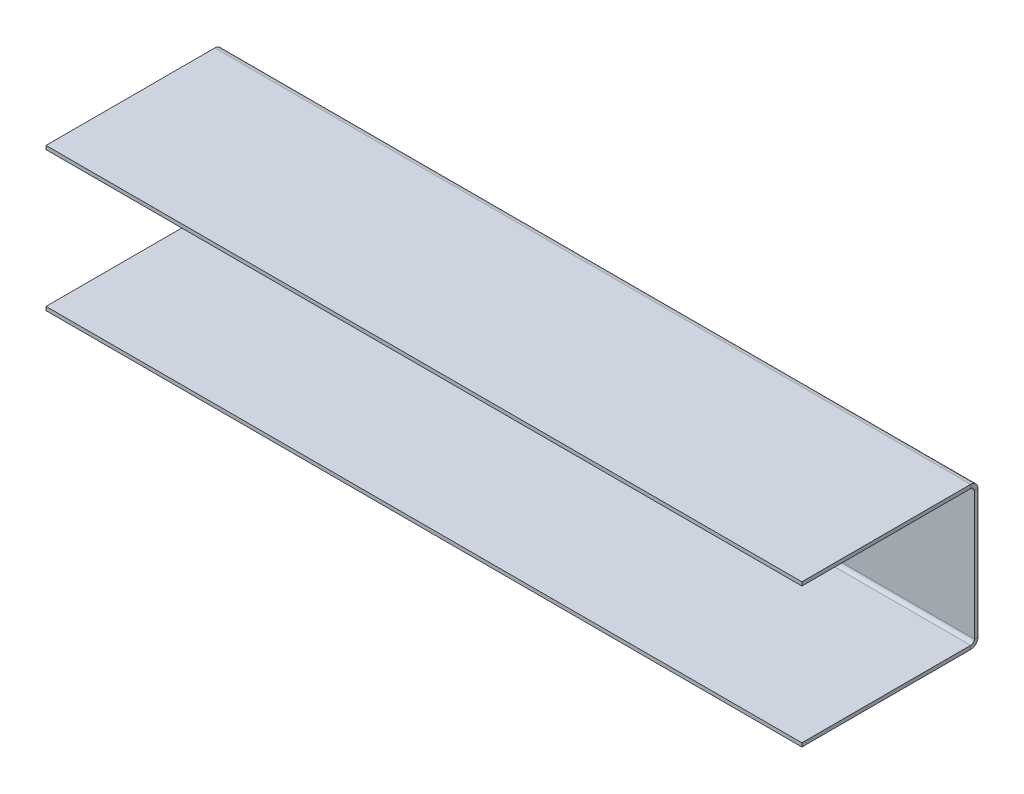
ISO-10303-21;
HEADER;
FILE_DESCRIPTION(('STEP AP214'),'2;1');
FILE_NAME('part.step','',(''),(''),'','','');
FILE_SCHEMA(('AUTOMOTIVE_DESIGN { 1 0 10303 214 1 1 1 1 }'));
ENDSEC;
DATA;
#1=APPLICATION_CONTEXT('core data for automotive mechanical design processes');
#2=APPLICATION_PROTOCOL_DEFINITION('international standard','automotive_design',2000,#1);
#3=PRODUCT_CONTEXT('',#1,'mechanical');
#4=PRODUCT('Part','Part','',(#3));
#5=PRODUCT_RELATED_PRODUCT_CATEGORY('part','',(#4));
#6=PRODUCT_DEFINITION_FORMATION('','',#4);
#7=PRODUCT_DEFINITION_CONTEXT('part definition',#1,'design');
#8=PRODUCT_DEFINITION('design','',#6,#7);
#9=PRODUCT_DEFINITION_SHAPE('','',#8);
#10=(LENGTH_UNIT() NAMED_UNIT(*) SI_UNIT(.MILLI.,.METRE.));
#11=(NAMED_UNIT(*) PLANE_ANGLE_UNIT() SI_UNIT($,.RADIAN.));
#12=(NAMED_UNIT(*) SI_UNIT($,.STERADIAN.) SOLID_ANGLE_UNIT());
#13=UNCERTAINTY_MEASURE_WITH_UNIT(LENGTH_MEASURE(1.E-05),#10,'distance_accuracy_value','');
#14=(GEOMETRIC_REPRESENTATION_CONTEXT(3) GLOBAL_UNCERTAINTY_ASSIGNED_CONTEXT((#13)) GLOBAL_UNIT_ASSIGNED_CONTEXT((#10,
#11,#12)) REPRESENTATION_CONTEXT('',''));
#15=CARTESIAN_POINT('',(0.,0.,0.));
#16=DIRECTION('',(0.,0.,1.));
#17=DIRECTION('',(1.,0.,0.));
#18=AXIS2_PLACEMENT_3D('',#15,#16,#17);
#19=CARTESIAN_POINT('',(654.05,0.,-146.05));
#20=DIRECTION('',(1.,0.,0.));
#21=DIRECTION('',(0.,0.,-1.));
#22=AXIS2_PLACEMENT_3D('',#19,#20,#21);
#23=PLANE('',#22);
#24=DIRECTION('',(0.,1.,0.));
#25=VECTOR('',#24,1.);
#26=CARTESIAN_POINT('',(654.05,0.,-146.05));
#27=LINE('',#26,#25);
#28=CARTESIAN_POINT('',(654.05,0.,-146.05));
#29=VERTEX_POINT('',#28);
#30=CARTESIAN_POINT('',(654.05,3.175,-146.05));
#31=VERTEX_POINT('',#30);
#32=EDGE_CURVE('E11',#29,#31,#27,.T.);
#33=ORIENTED_EDGE('',*,*,#32,.F.);
#34=CARTESIAN_POINT('',(654.05,6.35,-146.05));
#35=DIRECTION('',(-1.,0.,0.));
#36=DIRECTION('',(0.,0.,1.));
#37=AXIS2_PLACEMENT_3D('',#34,#35,#36);
#38=CIRCLE('',#37,6.35);
#39=CARTESIAN_POINT('',(654.05,6.35,-152.4));
#40=VERTEX_POINT('',#39);
#41=EDGE_CURVE('E147',#29,#40,#38,.F.);
#42=ORIENTED_EDGE('',*,*,#41,.T.);
#43=DIRECTION('',(0.,0.,-1.));
#44=VECTOR('',#43,1.);
#45=CARTESIAN_POINT('',(654.05,6.35,-149.225));
#46=LINE('',#45,#44);
#47=CARTESIAN_POINT('',(654.05,6.35,-149.225));
#48=VERTEX_POINT('',#47);
#49=EDGE_CURVE('E45',#48,#40,#46,.T.);
#50=ORIENTED_EDGE('',*,*,#49,.F.);
#51=CARTESIAN_POINT('',(654.05,6.35,-146.05));
#52=DIRECTION('',(1.,0.,0.));
#53=DIRECTION('',(0.,0.,-1.));
#54=AXIS2_PLACEMENT_3D('',#51,#52,#53);
#55=CIRCLE('',#54,3.175);
#56=EDGE_CURVE('E241',#31,#48,#55,.T.);
#57=ORIENTED_EDGE('',*,*,#56,.F.);
#58=EDGE_LOOP('',(#33,#42,#50,#57));
#59=FACE_BOUND('',#58,.T.);
#60=ADVANCED_FACE('F37',(#59),#23,.T.);
#61=CARTESIAN_POINT('',(654.05,6.35,-149.225));
#62=DIRECTION('',(1.,0.,0.));
#63=DIRECTION('',(0.,0.,-1.));
#64=AXIS2_PLACEMENT_3D('',#61,#62,#63);
#65=PLANE('',#64);
#66=DIRECTION('',(0.,0.,-1.));
#67=VECTOR('',#66,1.);
#68=CARTESIAN_POINT('',(654.05,0.,0.));
#69=LINE('',#68,#67);
#70=CARTESIAN_POINT('',(654.05,0.,0.));
#71=VERTEX_POINT('',#70);
#72=EDGE_CURVE('E152',#71,#29,#69,.T.);
#73=ORIENTED_EDGE('',*,*,#72,.T.);
#74=ORIENTED_EDGE('',*,*,#32,.T.);
#75=DIRECTION('',(0.,0.,-1.));
#76=VECTOR('',#75,1.);
#77=CARTESIAN_POINT('',(654.05,3.175,0.));
#78=LINE('',#77,#76);
#79=CARTESIAN_POINT('',(654.05,3.175,0.));
#80=VERTEX_POINT('',#79);
#81=EDGE_CURVE('E254',#80,#31,#78,.T.);
#82=ORIENTED_EDGE('',*,*,#81,.F.);
#83=DIRECTION('',(0.,1.,0.));
#84=VECTOR('',#83,1.);
#85=CARTESIAN_POINT('',(654.05,0.,0.));
#86=LINE('',#85,#84);
#87=EDGE_CURVE('E256',#71,#80,#86,.T.);
#88=ORIENTED_EDGE('',*,*,#87,.F.);
#89=EDGE_LOOP('',(#73,#74,#82,#88));
#90=FACE_BOUND('',#89,.T.);
#91=ADVANCED_FACE('F267',(#90),#65,.T.);
#92=CARTESIAN_POINT('',(0.,6.35,-152.4));
#93=DIRECTION('',(-1.,0.,0.));
#94=DIRECTION('',(0.,0.,1.));
#95=AXIS2_PLACEMENT_3D('',#92,#93,#94);
#96=PLANE('',#95);
#97=DIRECTION('',(0.,0.,1.));
#98=VECTOR('',#97,1.);
#99=CARTESIAN_POINT('',(0.,6.35,-152.4));
#100=LINE('',#99,#98);
#101=CARTESIAN_POINT('',(0.,6.35,-152.4));
#102=VERTEX_POINT('',#101);
#103=CARTESIAN_POINT('',(0.,6.35,-149.225));
#104=VERTEX_POINT('',#103);
#105=EDGE_CURVE('E145',#102,#104,#100,.T.);
#106=ORIENTED_EDGE('',*,*,#105,.F.);
#107=CARTESIAN_POINT('',(0.,6.35,-146.05));
#108=DIRECTION('',(-1.,0.,0.));
#109=DIRECTION('',(0.,0.,1.));
#110=AXIS2_PLACEMENT_3D('',#107,#108,#109);
#111=CIRCLE('',#110,6.35);
#112=CARTESIAN_POINT('',(0.,0.,-146.05));
#113=VERTEX_POINT('',#112);
#114=EDGE_CURVE('E159',#113,#102,#111,.F.);
#115=ORIENTED_EDGE('',*,*,#114,.F.);
#116=DIRECTION('',(0.,-1.,0.));
#117=VECTOR('',#116,1.);
#118=CARTESIAN_POINT('',(0.,3.175,-146.05));
#119=LINE('',#118,#117);
#120=CARTESIAN_POINT('',(0.,3.175,-146.05));
#121=VERTEX_POINT('',#120);
#122=EDGE_CURVE('E232',#121,#113,#119,.T.);
#123=ORIENTED_EDGE('',*,*,#122,.F.);
#124=CARTESIAN_POINT('',(0.,6.35,-146.05));
#125=DIRECTION('',(1.,0.,0.));
#126=DIRECTION('',(0.,0.,-1.));
#127=AXIS2_PLACEMENT_3D('',#124,#125,#126);
#128=CIRCLE('',#127,3.175);
#129=EDGE_CURVE('E186',#121,#104,#128,.T.);
#130=ORIENTED_EDGE('',*,*,#129,.T.);
#131=EDGE_LOOP('',(#106,#115,#123,#130));
#132=FACE_BOUND('',#131,.T.);
#133=ADVANCED_FACE('F246',(#132),#96,.T.);
#134=CARTESIAN_POINT('',(0.,3.175,-146.05));
#135=DIRECTION('',(-1.,0.,0.));
#136=DIRECTION('',(0.,0.,1.));
#137=AXIS2_PLACEMENT_3D('',#134,#135,#136);
#138=PLANE('',#137);
#139=DIRECTION('',(0.,1.,0.));
#140=VECTOR('',#139,1.);
#141=CARTESIAN_POINT('',(0.,0.,-152.4));
#142=LINE('',#141,#140);
#143=CARTESIAN_POINT('',(0.,117.475,-152.4));
#144=VERTEX_POINT('',#143);
#145=EDGE_CURVE('E199',#102,#144,#142,.T.);
#146=ORIENTED_EDGE('',*,*,#145,.F.);
#147=ORIENTED_EDGE('',*,*,#105,.T.);
#148=DIRECTION('',(0.,1.,0.));
#149=VECTOR('',#148,1.);
#150=CARTESIAN_POINT('',(0.,0.,-149.225));
#151=LINE('',#150,#149);
#152=CARTESIAN_POINT('',(0.,117.475,-149.225));
#153=VERTEX_POINT('',#152);
#154=EDGE_CURVE('E184',#104,#153,#151,.T.);
#155=ORIENTED_EDGE('',*,*,#154,.T.);
#156=DIRECTION('',(0.,0.,-1.));
#157=VECTOR('',#156,1.);
#158=CARTESIAN_POINT('',(0.,117.475,-149.225));
#159=LINE('',#158,#157);
#160=EDGE_CURVE('E94',#153,#144,#159,.T.);
#161=ORIENTED_EDGE('',*,*,#160,.T.);
#162=EDGE_LOOP('',(#146,#147,#155,#161));
#163=FACE_BOUND('',#162,.T.);
#164=ADVANCED_FACE('F234',(#163),#138,.T.);
#165=CARTESIAN_POINT('',(654.05,117.475,-152.4));
#166=DIRECTION('',(1.,0.,0.));
#167=DIRECTION('',(0.,0.,-1.));
#168=AXIS2_PLACEMENT_3D('',#165,#166,#167);
#169=PLANE('',#168);
#170=DIRECTION('',(0.,0.,1.));
#171=VECTOR('',#170,1.);
#172=CARTESIAN_POINT('',(654.05,117.475,-152.4));
#173=LINE('',#172,#171);
#174=CARTESIAN_POINT('',(654.05,117.475,-152.4));
#175=VERTEX_POINT('',#174);
#176=CARTESIAN_POINT('',(654.05,117.475,-149.225));
#177=VERTEX_POINT('',#176);
#178=EDGE_CURVE('E230',#175,#177,#173,.T.);
#179=ORIENTED_EDGE('',*,*,#178,.F.);
#180=CARTESIAN_POINT('',(654.05,117.475,-146.05));
#181=DIRECTION('',(-1.,0.,0.));
#182=DIRECTION('',(0.,0.,1.));
#183=AXIS2_PLACEMENT_3D('',#180,#181,#182);
#184=CIRCLE('',#183,6.35);
#185=CARTESIAN_POINT('',(654.05,123.825,-146.05));
#186=VERTEX_POINT('',#185);
#187=EDGE_CURVE('E167',#175,#186,#184,.F.);
#188=ORIENTED_EDGE('',*,*,#187,.T.);
#189=DIRECTION('',(0.,1.,0.));
#190=VECTOR('',#189,1.);
#191=CARTESIAN_POINT('',(654.05,120.65,-146.05));
#192=LINE('',#191,#190);
#193=CARTESIAN_POINT('',(654.05,120.65,-146.05));
#194=VERTEX_POINT('',#193);
#195=EDGE_CURVE('E53',#194,#186,#192,.T.);
#196=ORIENTED_EDGE('',*,*,#195,.F.);
#197=CARTESIAN_POINT('',(654.05,117.475,-146.05));
#198=DIRECTION('',(1.,0.,0.));
#199=DIRECTION('',(0.,0.,-1.));
#200=AXIS2_PLACEMENT_3D('',#197,#198,#199);
#201=CIRCLE('',#200,3.175);
#202=EDGE_CURVE('E258',#177,#194,#201,.T.);
#203=ORIENTED_EDGE('',*,*,#202,.F.);
#204=EDGE_LOOP('',(#179,#188,#196,#203));
#205=FACE_BOUND('',#204,.T.);
#206=ADVANCED_FACE('F293',(#205),#169,.T.);
#207=CARTESIAN_POINT('',(654.05,120.65,-146.05));
#208=DIRECTION('',(1.,0.,0.));
#209=DIRECTION('',(0.,0.,-1.));
#210=AXIS2_PLACEMENT_3D('',#207,#208,#209);
#211=PLANE('',#210);
#212=DIRECTION('',(0.,1.,0.));
#213=VECTOR('',#212,1.);
#214=CARTESIAN_POINT('',(654.05,0.,-152.4));
#215=LINE('',#214,#213);
#216=EDGE_CURVE('E137',#40,#175,#215,.T.);
#217=ORIENTED_EDGE('',*,*,#216,.T.);
#218=ORIENTED_EDGE('',*,*,#178,.T.);
#219=DIRECTION('',(0.,1.,0.));
#220=VECTOR('',#219,1.);
#221=CARTESIAN_POINT('',(654.05,0.,-149.225));
#222=LINE('',#221,#220);
#223=EDGE_CURVE('E140',#48,#177,#222,.T.);
#224=ORIENTED_EDGE('',*,*,#223,.F.);
#225=ORIENTED_EDGE('',*,*,#49,.T.);
#226=EDGE_LOOP('',(#217,#218,#224,#225));
#227=FACE_BOUND('',#226,.T.);
#228=ADVANCED_FACE('F135',(#227),#211,.T.);
#229=CARTESIAN_POINT('',(0.,123.825,-146.05));
#230=DIRECTION('',(-1.,0.,0.));
#231=DIRECTION('',(0.,0.,1.));
#232=AXIS2_PLACEMENT_3D('',#229,#230,#231);
#233=PLANE('',#232);
#234=DIRECTION('',(0.,-1.,0.));
#235=VECTOR('',#234,1.);
#236=CARTESIAN_POINT('',(0.,123.825,-146.05));
#237=LINE('',#236,#235);
#238=CARTESIAN_POINT('',(0.,123.825,-146.05));
#239=VERTEX_POINT('',#238);
#240=CARTESIAN_POINT('',(0.,120.65,-146.05));
#241=VERTEX_POINT('',#240);
#242=EDGE_CURVE('E101',#239,#241,#237,.T.);
#243=ORIENTED_EDGE('',*,*,#242,.F.);
#244=CARTESIAN_POINT('',(0.,117.475,-146.05));
#245=DIRECTION('',(-1.,0.,0.));
#246=DIRECTION('',(0.,0.,1.));
#247=AXIS2_PLACEMENT_3D('',#244,#245,#246);
#248=CIRCLE('',#247,6.35);
#249=EDGE_CURVE('E201',#144,#239,#248,.F.);
#250=ORIENTED_EDGE('',*,*,#249,.F.);
#251=ORIENTED_EDGE('',*,*,#160,.F.);
#252=CARTESIAN_POINT('',(0.,117.475,-146.05));
#253=DIRECTION('',(1.,0.,0.));
#254=DIRECTION('',(0.,0.,-1.));
#255=AXIS2_PLACEMENT_3D('',#252,#253,#254);
#256=CIRCLE('',#255,3.175);
#257=EDGE_CURVE('E182',#153,#241,#256,.T.);
#258=ORIENTED_EDGE('',*,*,#257,.T.);
#259=EDGE_LOOP('',(#243,#250,#251,#258));
#260=FACE_BOUND('',#259,.T.);
#261=ADVANCED_FACE('F299',(#260),#233,.T.);
#262=CARTESIAN_POINT('',(0.,117.475,-149.225));
#263=DIRECTION('',(-1.,0.,0.));
#264=DIRECTION('',(0.,0.,1.));
#265=AXIS2_PLACEMENT_3D('',#262,#263,#264);
#266=PLANE('',#265);
#267=DIRECTION('',(0.,0.,1.));
#268=VECTOR('',#267,1.);
#269=CARTESIAN_POINT('',(0.,123.825,-152.4));
#270=LINE('',#269,#268);
#271=CARTESIAN_POINT('',(0.,123.825,0.));
#272=VERTEX_POINT('',#271);
#273=EDGE_CURVE('E173',#239,#272,#270,.T.);
#274=ORIENTED_EDGE('',*,*,#273,.F.);
#275=ORIENTED_EDGE('',*,*,#242,.T.);
#276=DIRECTION('',(0.,0.,-1.));
#277=VECTOR('',#276,1.);
#278=CARTESIAN_POINT('',(0.,120.65,-152.4));
#279=LINE('',#278,#277);
#280=CARTESIAN_POINT('',(0.,120.65,0.));
#281=VERTEX_POINT('',#280);
#282=EDGE_CURVE('E179',#241,#281,#279,.F.);
#283=ORIENTED_EDGE('',*,*,#282,.T.);
#284=DIRECTION('',(0.,1.,0.));
#285=VECTOR('',#284,1.);
#286=CARTESIAN_POINT('',(0.,120.65,0.));
#287=LINE('',#286,#285);
#288=EDGE_CURVE('E176',#281,#272,#287,.T.);
#289=ORIENTED_EDGE('',*,*,#288,.T.);
#290=EDGE_LOOP('',(#274,#275,#283,#289));
#291=FACE_BOUND('',#290,.T.);
#292=ADVANCED_FACE('F302',(#291),#266,.T.);
#293=CARTESIAN_POINT('',(654.05,123.825,-152.4));
#294=DIRECTION('',(0.,-1.,0.));
#295=DIRECTION('',(0.,0.,-1.));
#296=AXIS2_PLACEMENT_3D('',#293,#294,#295);
#297=PLANE('',#296);
#298=ORIENTED_EDGE('',*,*,#273,.T.);
#299=DIRECTION('',(-1.,0.,0.));
#300=VECTOR('',#299,1.);
#301=CARTESIAN_POINT('',(654.05,123.825,0.));
#302=LINE('',#301,#300);
#303=CARTESIAN_POINT('',(654.05,123.825,0.));
#304=VERTEX_POINT('',#303);
#305=EDGE_CURVE('E225',#304,#272,#302,.T.);
#306=ORIENTED_EDGE('',*,*,#305,.F.);
#307=DIRECTION('',(0.,0.,1.));
#308=VECTOR('',#307,1.);
#309=CARTESIAN_POINT('',(654.05,123.825,-152.4));
#310=LINE('',#309,#308);
#311=EDGE_CURVE('E107',#186,#304,#310,.T.);
#312=ORIENTED_EDGE('',*,*,#311,.F.);
#313=DIRECTION('',(-1.,0.,0.));
#314=VECTOR('',#313,1.);
#315=CARTESIAN_POINT('',(654.05,123.825,-146.05));
#316=LINE('',#315,#314);
#317=EDGE_CURVE('E169',#186,#239,#316,.T.);
#318=ORIENTED_EDGE('',*,*,#317,.T.);
#319=EDGE_LOOP('',(#298,#306,#312,#318));
#320=FACE_BOUND('',#319,.T.);
#321=ADVANCED_FACE('F305',(#320),#297,.F.);
#322=CARTESIAN_POINT('',(654.05,120.65,0.));
#323=DIRECTION('',(0.,0.,1.));
#324=DIRECTION('',(0.,-1.,0.));
#325=AXIS2_PLACEMENT_3D('',#322,#323,#324);
#326=PLANE('',#325);
#327=ORIENTED_EDGE('',*,*,#288,.F.);
#328=DIRECTION('',(-1.,0.,0.));
#329=VECTOR('',#328,1.);
#330=CARTESIAN_POINT('',(654.05,120.65,0.));
#331=LINE('',#330,#329);
#332=CARTESIAN_POINT('',(654.05,120.65,0.));
#333=VERTEX_POINT('',#332);
#334=EDGE_CURVE('E223',#333,#281,#331,.T.);
#335=ORIENTED_EDGE('',*,*,#334,.F.);
#336=DIRECTION('',(0.,1.,0.));
#337=VECTOR('',#336,1.);
#338=CARTESIAN_POINT('',(654.05,120.65,0.));
#339=LINE('',#338,#337);
#340=EDGE_CURVE('E513',#333,#304,#339,.T.);
#341=ORIENTED_EDGE('',*,*,#340,.T.);
#342=ORIENTED_EDGE('',*,*,#305,.T.);
#343=EDGE_LOOP('',(#327,#335,#341,#342));
#344=FACE_BOUND('',#343,.T.);
#345=ADVANCED_FACE('F309',(#344),#326,.T.);
#346=CARTESIAN_POINT('',(654.05,120.65,-152.4));
#347=DIRECTION('',(0.,-1.,0.));
#348=DIRECTION('',(0.,0.,-1.));
#349=AXIS2_PLACEMENT_3D('',#346,#347,#348);
#350=PLANE('',#349);
#351=ORIENTED_EDGE('',*,*,#282,.F.);
#352=DIRECTION('',(-1.,0.,0.));
#353=VECTOR('',#352,1.);
#354=CARTESIAN_POINT('',(654.05,120.65,-146.05));
#355=LINE('',#354,#353);
#356=EDGE_CURVE('E220',#194,#241,#355,.T.);
#357=ORIENTED_EDGE('',*,*,#356,.F.);
#358=DIRECTION('',(0.,0.,-1.));
#359=VECTOR('',#358,1.);
#360=CARTESIAN_POINT('',(654.05,120.65,-152.4));
#361=LINE('',#360,#359);
#362=EDGE_CURVE('E515',#194,#333,#361,.F.);
#363=ORIENTED_EDGE('',*,*,#362,.T.);
#364=ORIENTED_EDGE('',*,*,#334,.T.);
#365=EDGE_LOOP('',(#351,#357,#363,#364));
#366=FACE_BOUND('',#365,.T.);
#367=ADVANCED_FACE('F313',(#366),#350,.T.);
#368=CARTESIAN_POINT('',(654.05,117.475,-146.05));
#369=DIRECTION('',(-1.,0.,0.));
#370=DIRECTION('',(0.,0.,1.));
#371=AXIS2_PLACEMENT_3D('',#368,#369,#370);
#372=CYLINDRICAL_SURFACE('',#371,3.175);
#373=ORIENTED_EDGE('',*,*,#257,.F.);
#374=DIRECTION('',(-1.,0.,0.));
#375=VECTOR('',#374,1.);
#376=CARTESIAN_POINT('',(654.05,117.475,-149.225));
#377=LINE('',#376,#375);
#378=EDGE_CURVE('E217',#177,#153,#377,.T.);
#379=ORIENTED_EDGE('',*,*,#378,.F.);
#380=ORIENTED_EDGE('',*,*,#202,.T.);
#381=ORIENTED_EDGE('',*,*,#356,.T.);
#382=EDGE_LOOP('',(#373,#379,#380,#381));
#383=FACE_BOUND('',#382,.T.);
#384=ADVANCED_FACE('F317',(#383),#372,.F.);
#385=CARTESIAN_POINT('',(654.05,0.,-149.225));
#386=DIRECTION('',(0.,0.,1.));
#387=DIRECTION('',(1.,0.,0.));
#388=AXIS2_PLACEMENT_3D('',#385,#386,#387);
#389=PLANE('',#388);
#390=ORIENTED_EDGE('',*,*,#154,.F.);
#391=DIRECTION('',(-1.,0.,0.));
#392=VECTOR('',#391,1.);
#393=CARTESIAN_POINT('',(654.05,6.35,-149.225));
#394=LINE('',#393,#392);
#395=EDGE_CURVE('E214',#48,#104,#394,.T.);
#396=ORIENTED_EDGE('',*,*,#395,.F.);
#397=ORIENTED_EDGE('',*,*,#223,.T.);
#398=ORIENTED_EDGE('',*,*,#378,.T.);
#399=EDGE_LOOP('',(#390,#396,#397,#398));
#400=FACE_BOUND('',#399,.T.);
#401=ADVANCED_FACE('F243',(#400),#389,.T.);
#402=CARTESIAN_POINT('',(654.05,6.35,-146.05));
#403=DIRECTION('',(-1.,0.,0.));
#404=DIRECTION('',(0.,0.,1.));
#405=AXIS2_PLACEMENT_3D('',#402,#403,#404);
#406=CYLINDRICAL_SURFACE('',#405,3.175);
#407=ORIENTED_EDGE('',*,*,#129,.F.);
#408=DIRECTION('',(-1.,0.,0.));
#409=VECTOR('',#408,1.);
#410=CARTESIAN_POINT('',(654.05,3.175,-146.05));
#411=LINE('',#410,#409);
#412=EDGE_CURVE('E211',#31,#121,#411,.T.);
#413=ORIENTED_EDGE('',*,*,#412,.F.);
#414=ORIENTED_EDGE('',*,*,#56,.T.);
#415=ORIENTED_EDGE('',*,*,#395,.T.);
#416=EDGE_LOOP('',(#407,#413,#414,#415));
#417=FACE_BOUND('',#416,.T.);
#418=ADVANCED_FACE('F239',(#417),#406,.F.);
#419=CARTESIAN_POINT('',(654.05,3.175,0.));
#420=DIRECTION('',(0.,1.,0.));
#421=DIRECTION('',(0.,0.,1.));
#422=AXIS2_PLACEMENT_3D('',#419,#420,#421);
#423=PLANE('',#422);
#424=DIRECTION('',(0.,0.,-1.));
#425=VECTOR('',#424,1.);
#426=CARTESIAN_POINT('',(0.,3.175,0.));
#427=LINE('',#426,#425);
#428=CARTESIAN_POINT('',(0.,3.175,0.));
#429=VERTEX_POINT('',#428);
#430=EDGE_CURVE('E189',#429,#121,#427,.T.);
#431=ORIENTED_EDGE('',*,*,#430,.F.);
#432=DIRECTION('',(-1.,0.,0.));
#433=VECTOR('',#432,1.);
#434=CARTESIAN_POINT('',(654.05,3.175,0.));
#435=LINE('',#434,#433);
#436=EDGE_CURVE('E209',#80,#429,#435,.T.);
#437=ORIENTED_EDGE('',*,*,#436,.F.);
#438=ORIENTED_EDGE('',*,*,#81,.T.);
#439=ORIENTED_EDGE('',*,*,#412,.T.);
#440=EDGE_LOOP('',(#431,#437,#438,#439));
#441=FACE_BOUND('',#440,.T.);
#442=ADVANCED_FACE('F252',(#441),#423,.T.);
#443=CARTESIAN_POINT('',(654.05,0.,0.));
#444=DIRECTION('',(0.,0.,1.));
#445=DIRECTION('',(1.,0.,0.));
#446=AXIS2_PLACEMENT_3D('',#443,#444,#445);
#447=PLANE('',#446);
#448=DIRECTION('',(0.,1.,0.));
#449=VECTOR('',#448,1.);
#450=CARTESIAN_POINT('',(0.,0.,0.));
#451=LINE('',#450,#449);
#452=CARTESIAN_POINT('',(0.,0.,0.));
#453=VERTEX_POINT('',#452);
#454=EDGE_CURVE('E192',#453,#429,#451,.T.);
#455=ORIENTED_EDGE('',*,*,#454,.F.);
#456=DIRECTION('',(-1.,0.,0.));
#457=VECTOR('',#456,1.);
#458=CARTESIAN_POINT('',(654.05,0.,0.));
#459=LINE('',#458,#457);
#460=EDGE_CURVE('E207',#71,#453,#459,.T.);
#461=ORIENTED_EDGE('',*,*,#460,.F.);
#462=ORIENTED_EDGE('',*,*,#87,.T.);
#463=ORIENTED_EDGE('',*,*,#436,.T.);
#464=EDGE_LOOP('',(#455,#461,#462,#463));
#465=FACE_BOUND('',#464,.T.);
#466=ADVANCED_FACE('F273',(#465),#447,.T.);
#467=CARTESIAN_POINT('',(654.05,0.,0.));
#468=DIRECTION('',(0.,1.,0.));
#469=DIRECTION('',(0.,0.,1.));
#470=AXIS2_PLACEMENT_3D('',#467,#468,#469);
#471=PLANE('',#470);
#472=DIRECTION('',(0.,0.,-1.));
#473=VECTOR('',#472,1.);
#474=CARTESIAN_POINT('',(0.,0.,0.));
#475=LINE('',#474,#473);
#476=EDGE_CURVE('E195',#453,#113,#475,.T.);
#477=ORIENTED_EDGE('',*,*,#476,.T.);
#478=DIRECTION('',(-1.,0.,0.));
#479=VECTOR('',#478,1.);
#480=CARTESIAN_POINT('',(654.05,0.,-146.05));
#481=LINE('',#480,#479);
#482=EDGE_CURVE('E161',#29,#113,#481,.T.);
#483=ORIENTED_EDGE('',*,*,#482,.F.);
#484=ORIENTED_EDGE('',*,*,#72,.F.);
#485=ORIENTED_EDGE('',*,*,#460,.T.);
#486=EDGE_LOOP('',(#477,#483,#484,#485));
#487=FACE_BOUND('',#486,.T.);
#488=ADVANCED_FACE('F269',(#487),#471,.F.);
#489=CARTESIAN_POINT('',(654.05,6.35,-146.05));
#490=DIRECTION('',(-1.,0.,0.));
#491=DIRECTION('',(0.,0.,1.));
#492=AXIS2_PLACEMENT_3D('',#489,#490,#491);
#493=CYLINDRICAL_SURFACE('',#492,6.35);
#494=ORIENTED_EDGE('',*,*,#114,.T.);
#495=DIRECTION('',(-1.,0.,0.));
#496=VECTOR('',#495,1.);
#497=CARTESIAN_POINT('',(654.05,6.35,-152.4));
#498=LINE('',#497,#496);
#499=EDGE_CURVE('E156',#40,#102,#498,.T.);
#500=ORIENTED_EDGE('',*,*,#499,.F.);
#501=ORIENTED_EDGE('',*,*,#41,.F.);
#502=ORIENTED_EDGE('',*,*,#482,.T.);
#503=EDGE_LOOP('',(#494,#500,#501,#502));
#504=FACE_BOUND('',#503,.T.);
#505=ADVANCED_FACE('F157',(#504),#493,.T.);
#506=CARTESIAN_POINT('',(654.05,0.,-152.4));
#507=DIRECTION('',(0.,0.,1.));
#508=DIRECTION('',(1.,0.,0.));
#509=AXIS2_PLACEMENT_3D('',#506,#507,#508);
#510=PLANE('',#509);
#511=ORIENTED_EDGE('',*,*,#145,.T.);
#512=DIRECTION('',(-1.,0.,0.));
#513=VECTOR('',#512,1.);
#514=CARTESIAN_POINT('',(654.05,117.475,-152.4));
#515=LINE('',#514,#513);
#516=EDGE_CURVE('E162',#175,#144,#515,.T.);
#517=ORIENTED_EDGE('',*,*,#516,.F.);
#518=ORIENTED_EDGE('',*,*,#216,.F.);
#519=ORIENTED_EDGE('',*,*,#499,.T.);
#520=EDGE_LOOP('',(#511,#517,#518,#519));
#521=FACE_BOUND('',#520,.T.);
#522=ADVANCED_FACE('F164',(#521),#510,.F.);
#523=CARTESIAN_POINT('',(654.05,117.475,-146.05));
#524=DIRECTION('',(-1.,0.,0.));
#525=DIRECTION('',(0.,0.,1.));
#526=AXIS2_PLACEMENT_3D('',#523,#524,#525);
#527=CYLINDRICAL_SURFACE('',#526,6.35);
#528=ORIENTED_EDGE('',*,*,#249,.T.);
#529=ORIENTED_EDGE('',*,*,#317,.F.);
#530=ORIENTED_EDGE('',*,*,#187,.F.);
#531=ORIENTED_EDGE('',*,*,#516,.T.);
#532=EDGE_LOOP('',(#528,#529,#530,#531));
#533=FACE_BOUND('',#532,.T.);
#534=ADVANCED_FACE('F364',(#533),#527,.T.);
#535=CARTESIAN_POINT('',(654.05,117.475,-146.05));
#536=DIRECTION('',(1.,0.,0.));
#537=DIRECTION('',(0.,0.,-1.));
#538=AXIS2_PLACEMENT_3D('',#535,#536,#537);
#539=PLANE('',#538);
#540=ORIENTED_EDGE('',*,*,#311,.T.);
#541=ORIENTED_EDGE('',*,*,#340,.F.);
#542=ORIENTED_EDGE('',*,*,#362,.F.);
#543=ORIENTED_EDGE('',*,*,#195,.T.);
#544=EDGE_LOOP('',(#540,#541,#542,#543));
#545=FACE_BOUND('',#544,.T.);
#546=ADVANCED_FACE('F374',(#545),#539,.T.);
#547=CARTESIAN_POINT('',(0.,117.475,-146.05));
#548=DIRECTION('',(1.,0.,0.));
#549=DIRECTION('',(0.,0.,-1.));
#550=AXIS2_PLACEMENT_3D('',#547,#548,#549);
#551=PLANE('',#550);
#552=ORIENTED_EDGE('',*,*,#430,.T.);
#553=ORIENTED_EDGE('',*,*,#122,.T.);
#554=ORIENTED_EDGE('',*,*,#476,.F.);
#555=ORIENTED_EDGE('',*,*,#454,.T.);
#556=EDGE_LOOP('',(#552,#553,#554,#555));
#557=FACE_BOUND('',#556,.T.);
#558=ADVANCED_FACE('F271',(#557),#551,.F.);
#559=CLOSED_SHELL('',(#60,#91,#133,#164,#206,#228,#261,#292,#321,#345,#367,#384,#401,#418,#442,
#466,#488,#505,#522,#534,#546,#558));
#560=MANIFOLD_SOLID_BREP('B2',#559);
#561=ADVANCED_BREP_SHAPE_REPRESENTATION('',(#18,#560),#14);
#562=SHAPE_DEFINITION_REPRESENTATION(#9,#561);
ENDSEC;
END-ISO-10303-21;
